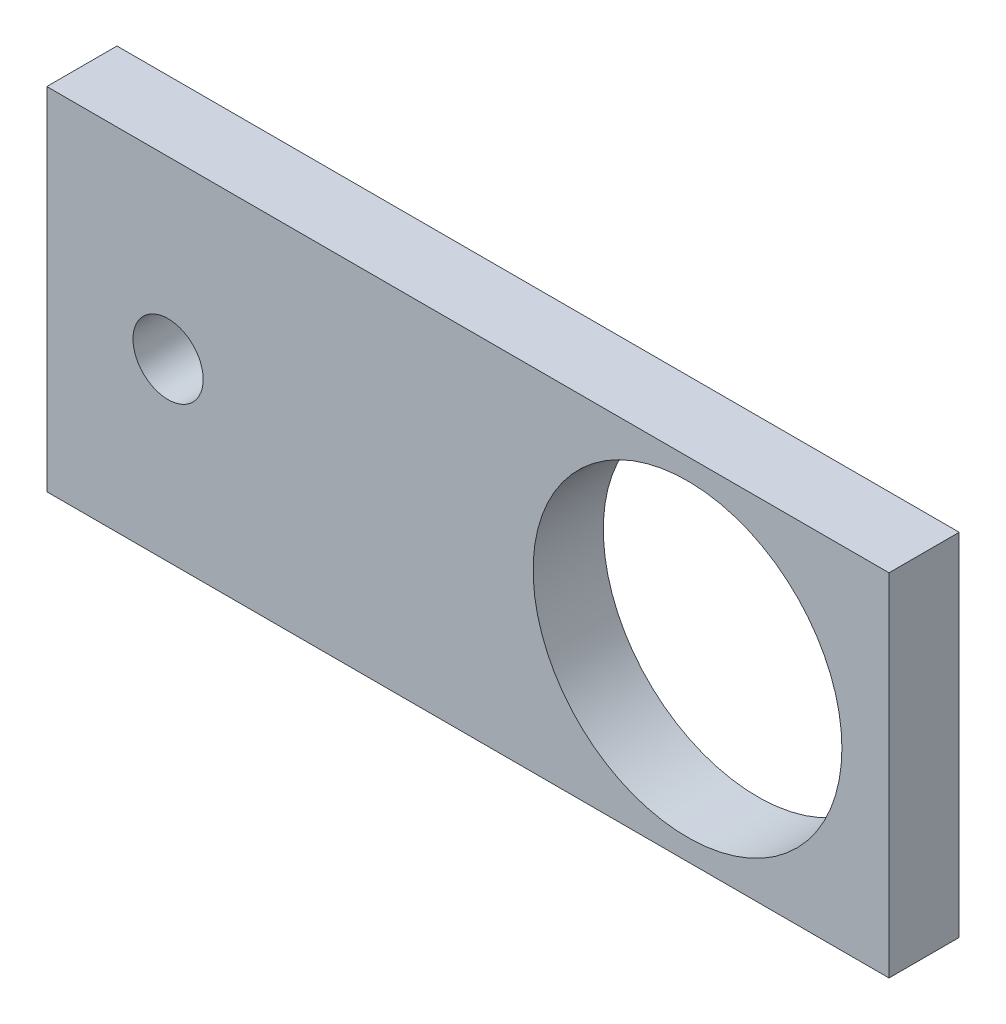
ISO-10303-21;
HEADER;
FILE_DESCRIPTION(('STEP AP214'),'2;1');
FILE_NAME('part.step','',(''),(''),'','','');
FILE_SCHEMA(('AUTOMOTIVE_DESIGN { 1 0 10303 214 1 1 1 1 }'));
ENDSEC;
DATA;
#1=APPLICATION_CONTEXT('core data for automotive mechanical design processes');
#2=APPLICATION_PROTOCOL_DEFINITION('international standard','automotive_design',2000,#1);
#3=PRODUCT_CONTEXT('',#1,'mechanical');
#4=PRODUCT('Part','Part','',(#3));
#5=PRODUCT_RELATED_PRODUCT_CATEGORY('part','',(#4));
#6=PRODUCT_DEFINITION_FORMATION('','',#4);
#7=PRODUCT_DEFINITION_CONTEXT('part definition',#1,'design');
#8=PRODUCT_DEFINITION('design','',#6,#7);
#9=PRODUCT_DEFINITION_SHAPE('','',#8);
#10=(LENGTH_UNIT() NAMED_UNIT(*) SI_UNIT(.MILLI.,.METRE.));
#11=(NAMED_UNIT(*) PLANE_ANGLE_UNIT() SI_UNIT($,.RADIAN.));
#12=(NAMED_UNIT(*) SI_UNIT($,.STERADIAN.) SOLID_ANGLE_UNIT());
#13=UNCERTAINTY_MEASURE_WITH_UNIT(LENGTH_MEASURE(1.E-05),#10,'distance_accuracy_value','');
#14=(GEOMETRIC_REPRESENTATION_CONTEXT(3) GLOBAL_UNCERTAINTY_ASSIGNED_CONTEXT((#13)) GLOBAL_UNIT_ASSIGNED_CONTEXT((#10,
#11,#12)) REPRESENTATION_CONTEXT('',''));
#15=CARTESIAN_POINT('',(0.,0.,0.));
#16=DIRECTION('',(0.,0.,1.));
#17=DIRECTION('',(1.,0.,0.));
#18=AXIS2_PLACEMENT_3D('',#15,#16,#17);
#19=CARTESIAN_POINT('',(0.,0.,5.));
#20=DIRECTION('',(0.,0.,-1.));
#21=DIRECTION('',(-1.,0.,0.));
#22=AXIS2_PLACEMENT_3D('',#19,#20,#21);
#23=PLANE('',#22);
#24=DIRECTION('',(0.,-1.,0.));
#25=VECTOR('',#24,1.);
#26=CARTESIAN_POINT('',(-30.,12.5,5.));
#27=LINE('',#26,#25);
#28=CARTESIAN_POINT('',(-30.,12.5,5.));
#29=VERTEX_POINT('',#28);
#30=CARTESIAN_POINT('',(-30.,-12.5,5.));
#31=VERTEX_POINT('',#30);
#32=EDGE_CURVE('E84',#29,#31,#27,.T.);
#33=ORIENTED_EDGE('',*,*,#32,.T.);
#34=DIRECTION('',(1.,0.,0.));
#35=VECTOR('',#34,1.);
#36=CARTESIAN_POINT('',(30.,-12.5,5.));
#37=LINE('',#36,#35);
#38=CARTESIAN_POINT('',(30.,-12.5,5.));
#39=VERTEX_POINT('',#38);
#40=EDGE_CURVE('E79',#31,#39,#37,.T.);
#41=ORIENTED_EDGE('',*,*,#40,.T.);
#42=DIRECTION('',(0.,1.,0.));
#43=VECTOR('',#42,1.);
#44=CARTESIAN_POINT('',(30.,12.5,5.));
#45=LINE('',#44,#43);
#46=CARTESIAN_POINT('',(30.,12.5,5.));
#47=VERTEX_POINT('',#46);
#48=EDGE_CURVE('E82',#39,#47,#45,.T.);
#49=ORIENTED_EDGE('',*,*,#48,.T.);
#50=DIRECTION('',(-1.,0.,0.));
#51=VECTOR('',#50,1.);
#52=CARTESIAN_POINT('',(30.,12.5,5.));
#53=LINE('',#52,#51);
#54=EDGE_CURVE('E49',#47,#29,#53,.T.);
#55=ORIENTED_EDGE('',*,*,#54,.T.);
#56=EDGE_LOOP('',(#33,#41,#49,#55));
#57=FACE_BOUND('',#56,.T.);
#58=CARTESIAN_POINT('',(-21.359853693078,0.,5.));
#59=DIRECTION('',(0.,0.,1.));
#60=DIRECTION('',(1.,0.,0.));
#61=AXIS2_PLACEMENT_3D('',#58,#59,#60);
#62=CIRCLE('',#61,2.5);
#63=CARTESIAN_POINT('',(-18.859853693078,0.,5.));
#64=VERTEX_POINT('',#63);
#65=EDGE_CURVE('E99',#64,#64,#62,.T.);
#66=ORIENTED_EDGE('',*,*,#65,.F.);
#67=EDGE_LOOP('',(#66));
#68=FACE_BOUND('',#67,.T.);
#69=CARTESIAN_POINT('',(15.644174595942,0.,5.));
#70=DIRECTION('',(0.,0.,1.));
#71=DIRECTION('',(1.,0.,0.));
#72=AXIS2_PLACEMENT_3D('',#69,#70,#71);
#73=CIRCLE('',#72,11.);
#74=CARTESIAN_POINT('',(26.644174595942,0.,5.));
#75=VERTEX_POINT('',#74);
#76=EDGE_CURVE('E114',#75,#75,#73,.T.);
#77=ORIENTED_EDGE('',*,*,#76,.F.);
#78=EDGE_LOOP('',(#77));
#79=FACE_BOUND('',#78,.T.);
#80=ADVANCED_FACE('F32',(#57,#68,#79),#23,.F.);
#81=CARTESIAN_POINT('',(0.,0.,0.));
#82=DIRECTION('',(0.,0.,-1.));
#83=DIRECTION('',(-1.,0.,0.));
#84=AXIS2_PLACEMENT_3D('',#81,#82,#83);
#85=PLANE('',#84);
#86=CARTESIAN_POINT('',(-21.359853693078,0.,0.));
#87=DIRECTION('',(0.,0.,1.));
#88=DIRECTION('',(1.,0.,0.));
#89=AXIS2_PLACEMENT_3D('',#86,#87,#88);
#90=CIRCLE('',#89,2.5);
#91=CARTESIAN_POINT('',(-18.859853693078,0.,0.));
#92=VERTEX_POINT('',#91);
#93=EDGE_CURVE('E111',#92,#92,#90,.T.);
#94=ORIENTED_EDGE('',*,*,#93,.T.);
#95=EDGE_LOOP('',(#94));
#96=FACE_BOUND('',#95,.T.);
#97=DIRECTION('',(0.,-1.,0.));
#98=VECTOR('',#97,1.);
#99=CARTESIAN_POINT('',(-30.,12.5,0.));
#100=LINE('',#99,#98);
#101=CARTESIAN_POINT('',(-30.,12.5,0.));
#102=VERTEX_POINT('',#101);
#103=CARTESIAN_POINT('',(-30.,-12.5,0.));
#104=VERTEX_POINT('',#103);
#105=EDGE_CURVE('E96',#102,#104,#100,.T.);
#106=ORIENTED_EDGE('',*,*,#105,.F.);
#107=DIRECTION('',(-1.,0.,0.));
#108=VECTOR('',#107,1.);
#109=CARTESIAN_POINT('',(30.,12.5,0.));
#110=LINE('',#109,#108);
#111=CARTESIAN_POINT('',(30.,12.5,0.));
#112=VERTEX_POINT('',#111);
#113=EDGE_CURVE('E72',#112,#102,#110,.T.);
#114=ORIENTED_EDGE('',*,*,#113,.F.);
#115=DIRECTION('',(0.,1.,0.));
#116=VECTOR('',#115,1.);
#117=CARTESIAN_POINT('',(30.,12.5,0.));
#118=LINE('',#117,#116);
#119=CARTESIAN_POINT('',(30.,-12.5,0.));
#120=VERTEX_POINT('',#119);
#121=EDGE_CURVE('E66',#120,#112,#118,.T.);
#122=ORIENTED_EDGE('',*,*,#121,.F.);
#123=DIRECTION('',(1.,0.,0.));
#124=VECTOR('',#123,1.);
#125=CARTESIAN_POINT('',(30.,-12.5,0.));
#126=LINE('',#125,#124);
#127=EDGE_CURVE('E88',#104,#120,#126,.T.);
#128=ORIENTED_EDGE('',*,*,#127,.F.);
#129=EDGE_LOOP('',(#106,#114,#122,#128));
#130=FACE_BOUND('',#129,.T.);
#131=CARTESIAN_POINT('',(15.644174595942,0.,0.));
#132=DIRECTION('',(0.,0.,1.));
#133=DIRECTION('',(1.,0.,0.));
#134=AXIS2_PLACEMENT_3D('',#131,#132,#133);
#135=CIRCLE('',#134,11.);
#136=CARTESIAN_POINT('',(26.644174595942,0.,0.));
#137=VERTEX_POINT('',#136);
#138=EDGE_CURVE('E117',#137,#137,#135,.T.);
#139=ORIENTED_EDGE('',*,*,#138,.T.);
#140=EDGE_LOOP('',(#139));
#141=FACE_BOUND('',#140,.T.);
#142=ADVANCED_FACE('F107',(#96,#130,#141),#85,.T.);
#143=CARTESIAN_POINT('',(-30.,12.5,5.));
#144=DIRECTION('',(1.,0.,0.));
#145=DIRECTION('',(0.,1.,0.));
#146=AXIS2_PLACEMENT_3D('',#143,#144,#145);
#147=PLANE('',#146);
#148=ORIENTED_EDGE('',*,*,#105,.T.);
#149=DIRECTION('',(0.,0.,-1.));
#150=VECTOR('',#149,1.);
#151=CARTESIAN_POINT('',(-30.,-12.5,5.));
#152=LINE('',#151,#150);
#153=EDGE_CURVE('E11',#31,#104,#152,.T.);
#154=ORIENTED_EDGE('',*,*,#153,.F.);
#155=ORIENTED_EDGE('',*,*,#32,.F.);
#156=DIRECTION('',(0.,0.,-1.));
#157=VECTOR('',#156,1.);
#158=CARTESIAN_POINT('',(-30.,12.5,5.));
#159=LINE('',#158,#157);
#160=EDGE_CURVE('E92',#29,#102,#159,.T.);
#161=ORIENTED_EDGE('',*,*,#160,.T.);
#162=EDGE_LOOP('',(#148,#154,#155,#161));
#163=FACE_BOUND('',#162,.T.);
#164=ADVANCED_FACE('F34',(#163),#147,.F.);
#165=CARTESIAN_POINT('',(30.,-12.5,5.));
#166=DIRECTION('',(0.,1.,0.));
#167=DIRECTION('',(-1.,0.,0.));
#168=AXIS2_PLACEMENT_3D('',#165,#166,#167);
#169=PLANE('',#168);
#170=ORIENTED_EDGE('',*,*,#127,.T.);
#171=DIRECTION('',(0.,0.,-1.));
#172=VECTOR('',#171,1.);
#173=CARTESIAN_POINT('',(30.,-12.5,5.));
#174=LINE('',#173,#172);
#175=EDGE_CURVE('E41',#39,#120,#174,.T.);
#176=ORIENTED_EDGE('',*,*,#175,.F.);
#177=ORIENTED_EDGE('',*,*,#40,.F.);
#178=ORIENTED_EDGE('',*,*,#153,.T.);
#179=EDGE_LOOP('',(#170,#176,#177,#178));
#180=FACE_BOUND('',#179,.T.);
#181=ADVANCED_FACE('F87',(#180),#169,.F.);
#182=CARTESIAN_POINT('',(30.,12.5,5.));
#183=DIRECTION('',(-1.,0.,0.));
#184=DIRECTION('',(0.,-1.,0.));
#185=AXIS2_PLACEMENT_3D('',#182,#183,#184);
#186=PLANE('',#185);
#187=ORIENTED_EDGE('',*,*,#121,.T.);
#188=DIRECTION('',(0.,0.,-1.));
#189=VECTOR('',#188,1.);
#190=CARTESIAN_POINT('',(30.,12.5,5.));
#191=LINE('',#190,#189);
#192=EDGE_CURVE('E89',#47,#112,#191,.T.);
#193=ORIENTED_EDGE('',*,*,#192,.F.);
#194=ORIENTED_EDGE('',*,*,#48,.F.);
#195=ORIENTED_EDGE('',*,*,#175,.T.);
#196=EDGE_LOOP('',(#187,#193,#194,#195));
#197=FACE_BOUND('',#196,.T.);
#198=ADVANCED_FACE('F90',(#197),#186,.F.);
#199=CARTESIAN_POINT('',(30.,12.5,5.));
#200=DIRECTION('',(0.,-1.,0.));
#201=DIRECTION('',(1.,0.,0.));
#202=AXIS2_PLACEMENT_3D('',#199,#200,#201);
#203=PLANE('',#202);
#204=ORIENTED_EDGE('',*,*,#113,.T.);
#205=ORIENTED_EDGE('',*,*,#160,.F.);
#206=ORIENTED_EDGE('',*,*,#54,.F.);
#207=ORIENTED_EDGE('',*,*,#192,.T.);
#208=EDGE_LOOP('',(#204,#205,#206,#207));
#209=FACE_BOUND('',#208,.T.);
#210=ADVANCED_FACE('F104',(#209),#203,.F.);
#211=CARTESIAN_POINT('',(-21.359853693078,0.,5.));
#212=DIRECTION('',(0.,0.,-1.));
#213=DIRECTION('',(-1.,0.,0.));
#214=AXIS2_PLACEMENT_3D('',#211,#212,#213);
#215=CYLINDRICAL_SURFACE('',#214,2.5);
#216=ORIENTED_EDGE('',*,*,#65,.T.);
#217=EDGE_LOOP('',(#216));
#218=FACE_BOUND('',#217,.T.);
#219=ORIENTED_EDGE('',*,*,#93,.F.);
#220=EDGE_LOOP('',(#219));
#221=FACE_BOUND('',#220,.T.);
#222=ADVANCED_FACE('F134',(#218,#221),#215,.F.);
#223=CARTESIAN_POINT('',(15.644174595942,0.,5.));
#224=DIRECTION('',(0.,0.,-1.));
#225=DIRECTION('',(-1.,0.,0.));
#226=AXIS2_PLACEMENT_3D('',#223,#224,#225);
#227=CYLINDRICAL_SURFACE('',#226,11.);
#228=ORIENTED_EDGE('',*,*,#76,.T.);
#229=EDGE_LOOP('',(#228));
#230=FACE_BOUND('',#229,.T.);
#231=ORIENTED_EDGE('',*,*,#138,.F.);
#232=EDGE_LOOP('',(#231));
#233=FACE_BOUND('',#232,.T.);
#234=ADVANCED_FACE('F123',(#230,#233),#227,.F.);
#235=CLOSED_SHELL('',(#80,#142,#164,#181,#198,#210,#222,#234));
#236=MANIFOLD_SOLID_BREP('B2',#235);
#237=ADVANCED_BREP_SHAPE_REPRESENTATION('',(#18,#236),#14);
#238=SHAPE_DEFINITION_REPRESENTATION(#9,#237);
ENDSEC;
END-ISO-10303-21;
